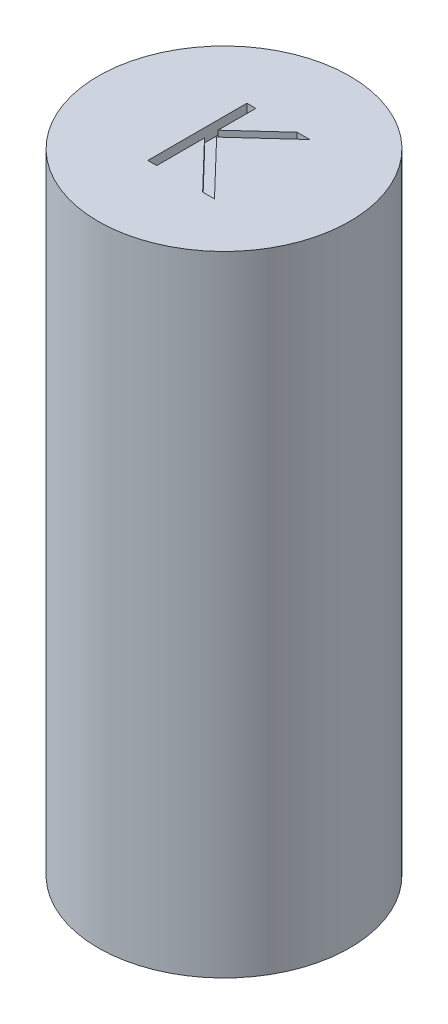
ISO-10303-21;
HEADER;
FILE_DESCRIPTION(('STEP AP214'),'2;1');
FILE_NAME('part.step','',(''),(''),'','','');
FILE_SCHEMA(('AUTOMOTIVE_DESIGN { 1 0 10303 214 1 1 1 1 }'));
ENDSEC;
DATA;
#1=APPLICATION_CONTEXT('core data for automotive mechanical design processes');
#2=APPLICATION_PROTOCOL_DEFINITION('international standard','automotive_design',2000,#1);
#3=PRODUCT_CONTEXT('',#1,'mechanical');
#4=PRODUCT('Part','Part','',(#3));
#5=PRODUCT_RELATED_PRODUCT_CATEGORY('part','',(#4));
#6=PRODUCT_DEFINITION_FORMATION('','',#4);
#7=PRODUCT_DEFINITION_CONTEXT('part definition',#1,'design');
#8=PRODUCT_DEFINITION('design','',#6,#7);
#9=PRODUCT_DEFINITION_SHAPE('','',#8);
#10=(LENGTH_UNIT() NAMED_UNIT(*) SI_UNIT(.MILLI.,.METRE.));
#11=(NAMED_UNIT(*) PLANE_ANGLE_UNIT() SI_UNIT($,.RADIAN.));
#12=(NAMED_UNIT(*) SI_UNIT($,.STERADIAN.) SOLID_ANGLE_UNIT());
#13=UNCERTAINTY_MEASURE_WITH_UNIT(LENGTH_MEASURE(1.E-05),#10,'distance_accuracy_value','');
#14=(GEOMETRIC_REPRESENTATION_CONTEXT(3) GLOBAL_UNCERTAINTY_ASSIGNED_CONTEXT((#13)) GLOBAL_UNIT_ASSIGNED_CONTEXT((#10,
#11,#12)) REPRESENTATION_CONTEXT('',''));
#15=CARTESIAN_POINT('',(0.,0.,0.));
#16=DIRECTION('',(0.,0.,1.));
#17=DIRECTION('',(1.,0.,0.));
#18=AXIS2_PLACEMENT_3D('',#15,#16,#17);
#19=CARTESIAN_POINT('',(0.,95.25,0.));
#20=DIRECTION('',(0.,1.,0.));
#21=DIRECTION('',(0.,0.,1.));
#22=AXIS2_PLACEMENT_3D('',#19,#20,#21);
#23=PLANE('',#22);
#24=CARTESIAN_POINT('',(0.,95.25,0.));
#25=DIRECTION('',(0.,1.,0.));
#26=DIRECTION('',(0.,0.,1.));
#27=AXIS2_PLACEMENT_3D('',#24,#25,#26);
#28=CIRCLE('',#27,19.05);
#29=CARTESIAN_POINT('',(0.,95.25,19.05));
#30=VERTEX_POINT('',#29);
#31=EDGE_CURVE('E11',#30,#30,#28,.T.);
#32=ORIENTED_EDGE('',*,*,#31,.T.);
#33=EDGE_LOOP('',(#32));
#34=FACE_BOUND('',#33,.T.);
#35=DIRECTION('',(-1.,0.,0.));
#36=VECTOR('',#35,1.);
#37=CARTESIAN_POINT('',(-2.88461538461538,95.25,7.30456727166714));
#38=LINE('',#37,#36);
#39=CARTESIAN_POINT('',(-2.88461538461538,95.25,7.30456727166714));
#40=VERTEX_POINT('',#39);
#41=CARTESIAN_POINT('',(-4.23076923076923,95.25,7.30456727166714));
#42=VERTEX_POINT('',#41);
#43=EDGE_CURVE('E195',#40,#42,#38,.T.);
#44=ORIENTED_EDGE('',*,*,#43,.T.);
#45=DIRECTION('',(0.,0.,-1.));
#46=VECTOR('',#45,1.);
#47=CARTESIAN_POINT('',(-4.23076923076923,95.25,7.30456727166714));
#48=LINE('',#47,#46);
#49=CARTESIAN_POINT('',(-4.23076923076923,95.25,-7.69543272833286));
#50=VERTEX_POINT('',#49);
#51=EDGE_CURVE('E55',#42,#50,#48,.T.);
#52=ORIENTED_EDGE('',*,*,#51,.T.);
#53=DIRECTION('',(1.,0.,0.));
#54=VECTOR('',#53,1.);
#55=CARTESIAN_POINT('',(-4.23076923076923,95.25,-7.69543272833286));
#56=LINE('',#55,#54);
#57=CARTESIAN_POINT('',(-2.88461538461538,95.25,-7.69543272833286));
#58=VERTEX_POINT('',#57);
#59=EDGE_CURVE('E162',#50,#58,#56,.T.);
#60=ORIENTED_EDGE('',*,*,#59,.T.);
#61=DIRECTION('',(0.,0.,1.));
#62=VECTOR('',#61,1.);
#63=CARTESIAN_POINT('',(-2.88461538461538,95.25,-7.69543272833286));
#64=LINE('',#63,#62);
#65=CARTESIAN_POINT('',(-2.88461538461538,95.25,-1.98329330525594));
#66=VERTEX_POINT('',#65);
#67=EDGE_CURVE('E166',#58,#66,#64,.T.);
#68=ORIENTED_EDGE('',*,*,#67,.T.);
#69=DIRECTION('',(0.738316488626765,0.,-0.67445441849086));
#70=VECTOR('',#69,1.);
#71=CARTESIAN_POINT('',(-2.88461538461538,95.25,-1.98329330525594));
#72=LINE('',#71,#70);
#73=CARTESIAN_POINT('',(3.36838942307693,95.25,-7.69543272833286));
#74=VERTEX_POINT('',#73);
#75=EDGE_CURVE('E170',#66,#74,#72,.T.);
#76=ORIENTED_EDGE('',*,*,#75,.T.);
#77=DIRECTION('',(1.,0.,0.));
#78=VECTOR('',#77,1.);
#79=CARTESIAN_POINT('',(3.36838942307693,95.25,-7.69543272833286));
#80=LINE('',#79,#78);
#81=CARTESIAN_POINT('',(5.28846153846154,95.25,-7.69543272833286));
#82=VERTEX_POINT('',#81);
#83=EDGE_CURVE('E174',#74,#82,#80,.T.);
#84=ORIENTED_EDGE('',*,*,#83,.T.);
#85=DIRECTION('',(-0.738439871406961,0.,0.674319328149854));
#86=VECTOR('',#85,1.);
#87=CARTESIAN_POINT('',(5.28846153846154,95.25,-7.69543272833286));
#88=LINE('',#87,#86);
#89=CARTESIAN_POINT('',(-2.08233173076923,95.25,-0.964663497563628));
#90=VERTEX_POINT('',#89);
#91=EDGE_CURVE('E178',#82,#90,#88,.T.);
#92=ORIENTED_EDGE('',*,*,#91,.T.);
#93=DIRECTION('',(0.692951629324606,0.,0.720984077089344));
#94=VECTOR('',#93,1.);
#95=CARTESIAN_POINT('',(-2.08233173076923,95.25,-0.964663497563628));
#96=LINE('',#95,#94);
#97=CARTESIAN_POINT('',(5.86538461538462,95.25,7.30456727166714));
#98=VERTEX_POINT('',#97);
#99=EDGE_CURVE('E182',#90,#98,#96,.T.);
#100=ORIENTED_EDGE('',*,*,#99,.T.);
#101=DIRECTION('',(-1.,0.,0.));
#102=VECTOR('',#101,1.);
#103=CARTESIAN_POINT('',(5.86538461538462,95.25,7.30456727166714));
#104=LINE('',#103,#102);
#105=CARTESIAN_POINT('',(4.07151442307692,95.25,7.30456727166714));
#106=VERTEX_POINT('',#105);
#107=EDGE_CURVE('E186',#98,#106,#104,.T.);
#108=ORIENTED_EDGE('',*,*,#107,.T.);
#109=DIRECTION('',(-0.692899332064652,0.,-0.721034337340712));
#110=VECTOR('',#109,1.);
#111=CARTESIAN_POINT('',(4.07151442307692,95.25,7.30456727166714));
#112=LINE('',#111,#110);
#113=CARTESIAN_POINT('',(-2.88461538461538,95.25,0.0659855408979108));
#114=VERTEX_POINT('',#113);
#115=EDGE_CURVE('E190',#106,#114,#112,.T.);
#116=ORIENTED_EDGE('',*,*,#115,.T.);
#117=DIRECTION('',(0.,0.,1.));
#118=VECTOR('',#117,1.);
#119=CARTESIAN_POINT('',(-2.88461538461538,95.25,0.0659855408979108));
#120=LINE('',#119,#118);
#121=EDGE_CURVE('E148',#114,#40,#120,.T.);
#122=ORIENTED_EDGE('',*,*,#121,.T.);
#123=EDGE_LOOP('',(#44,#52,#60,#68,#76,#84,#92,#100,#108,#116,#122));
#124=FACE_BOUND('',#123,.T.);
#125=ADVANCED_FACE('F39',(#34,#124),#23,.T.);
#126=CARTESIAN_POINT('',(0.,95.25,0.));
#127=DIRECTION('',(0.,-1.,0.));
#128=DIRECTION('',(0.,0.,-1.));
#129=AXIS2_PLACEMENT_3D('',#126,#127,#128);
#130=CYLINDRICAL_SURFACE('',#129,19.05);
#131=ORIENTED_EDGE('',*,*,#31,.F.);
#132=EDGE_LOOP('',(#131));
#133=FACE_BOUND('',#132,.T.);
#134=CARTESIAN_POINT('',(0.,0.,0.));
#135=DIRECTION('',(0.,1.,0.));
#136=DIRECTION('',(0.,0.,1.));
#137=AXIS2_PLACEMENT_3D('',#134,#135,#136);
#138=CIRCLE('',#137,19.05);
#139=CARTESIAN_POINT('',(0.,0.,19.05));
#140=VERTEX_POINT('',#139);
#141=EDGE_CURVE('E43',#140,#140,#138,.T.);
#142=ORIENTED_EDGE('',*,*,#141,.T.);
#143=EDGE_LOOP('',(#142));
#144=FACE_BOUND('',#143,.T.);
#145=ADVANCED_FACE('F41',(#133,#144),#130,.T.);
#146=CARTESIAN_POINT('',(0.,0.,0.));
#147=DIRECTION('',(0.,1.,0.));
#148=DIRECTION('',(0.,0.,1.));
#149=AXIS2_PLACEMENT_3D('',#146,#147,#148);
#150=PLANE('',#149);
#151=ORIENTED_EDGE('',*,*,#141,.F.);
#152=EDGE_LOOP('',(#151));
#153=FACE_BOUND('',#152,.T.);
#154=ADVANCED_FACE('F232',(#153),#150,.F.);
#155=CARTESIAN_POINT('',(-4.23076923076923,93.25,7.30456727166714));
#156=DIRECTION('',(1.,0.,0.));
#157=DIRECTION('',(0.,0.,-1.));
#158=AXIS2_PLACEMENT_3D('',#155,#156,#157);
#159=PLANE('',#158);
#160=ORIENTED_EDGE('',*,*,#51,.F.);
#161=DIRECTION('',(0.,1.,0.));
#162=VECTOR('',#161,1.);
#163=CARTESIAN_POINT('',(-4.23076923076923,93.25,7.30456727166714));
#164=LINE('',#163,#162);
#165=CARTESIAN_POINT('',(-4.23076923076923,93.25,7.30456727166714));
#166=VERTEX_POINT('',#165);
#167=EDGE_CURVE('E156',#166,#42,#164,.T.);
#168=ORIENTED_EDGE('',*,*,#167,.F.);
#169=DIRECTION('',(0.,0.,-1.));
#170=VECTOR('',#169,1.);
#171=CARTESIAN_POINT('',(-4.23076923076923,93.25,7.30456727166714));
#172=LINE('',#171,#170);
#173=CARTESIAN_POINT('',(-4.23076923076923,93.25,-7.69543272833286));
#174=VERTEX_POINT('',#173);
#175=EDGE_CURVE('E199',#166,#174,#172,.T.);
#176=ORIENTED_EDGE('',*,*,#175,.T.);
#177=DIRECTION('',(0.,1.,0.));
#178=VECTOR('',#177,1.);
#179=CARTESIAN_POINT('',(-4.23076923076923,93.25,-7.69543272833286));
#180=LINE('',#179,#178);
#181=EDGE_CURVE('E224',#174,#50,#180,.T.);
#182=ORIENTED_EDGE('',*,*,#181,.T.);
#183=EDGE_LOOP('',(#160,#168,#176,#182));
#184=FACE_BOUND('',#183,.T.);
#185=ADVANCED_FACE('F234',(#184),#159,.T.);
#186=CARTESIAN_POINT('',(-4.23076923076923,93.25,-7.69543272833286));
#187=DIRECTION('',(0.,0.,1.));
#188=DIRECTION('',(1.,0.,0.));
#189=AXIS2_PLACEMENT_3D('',#186,#187,#188);
#190=PLANE('',#189);
#191=ORIENTED_EDGE('',*,*,#59,.F.);
#192=ORIENTED_EDGE('',*,*,#181,.F.);
#193=DIRECTION('',(1.,0.,0.));
#194=VECTOR('',#193,1.);
#195=CARTESIAN_POINT('',(-4.23076923076923,93.25,-7.69543272833286));
#196=LINE('',#195,#194);
#197=CARTESIAN_POINT('',(-2.88461538461538,93.25,-7.69543272833286));
#198=VERTEX_POINT('',#197);
#199=EDGE_CURVE('E109',#174,#198,#196,.T.);
#200=ORIENTED_EDGE('',*,*,#199,.T.);
#201=DIRECTION('',(0.,1.,0.));
#202=VECTOR('',#201,1.);
#203=CARTESIAN_POINT('',(-2.88461538461538,93.25,-7.69543272833286));
#204=LINE('',#203,#202);
#205=EDGE_CURVE('E221',#198,#58,#204,.T.);
#206=ORIENTED_EDGE('',*,*,#205,.T.);
#207=EDGE_LOOP('',(#191,#192,#200,#206));
#208=FACE_BOUND('',#207,.T.);
#209=ADVANCED_FACE('F239',(#208),#190,.T.);
#210=CARTESIAN_POINT('',(-2.88461538461538,93.25,-7.69543272833286));
#211=DIRECTION('',(-1.,0.,0.));
#212=DIRECTION('',(0.,0.,1.));
#213=AXIS2_PLACEMENT_3D('',#210,#211,#212);
#214=PLANE('',#213);
#215=ORIENTED_EDGE('',*,*,#67,.F.);
#216=ORIENTED_EDGE('',*,*,#205,.F.);
#217=DIRECTION('',(0.,0.,1.));
#218=VECTOR('',#217,1.);
#219=CARTESIAN_POINT('',(-2.88461538461538,93.25,-7.69543272833286));
#220=LINE('',#219,#218);
#221=CARTESIAN_POINT('',(-2.88461538461538,93.25,-1.98329330525594));
#222=VERTEX_POINT('',#221);
#223=EDGE_CURVE('E388',#198,#222,#220,.T.);
#224=ORIENTED_EDGE('',*,*,#223,.T.);
#225=DIRECTION('',(0.,1.,0.));
#226=VECTOR('',#225,1.);
#227=CARTESIAN_POINT('',(-2.88461538461538,93.25,-1.98329330525594));
#228=LINE('',#227,#226);
#229=EDGE_CURVE('E218',#222,#66,#228,.T.);
#230=ORIENTED_EDGE('',*,*,#229,.T.);
#231=EDGE_LOOP('',(#215,#216,#224,#230));
#232=FACE_BOUND('',#231,.T.);
#233=ADVANCED_FACE('F251',(#232),#214,.T.);
#234=CARTESIAN_POINT('',(-2.88461538461538,93.25,-1.98329330525594));
#235=DIRECTION('',(0.67445441849086,0.,0.738316488626765));
#236=DIRECTION('',(0.738316488626765,0.,-0.67445441849086));
#237=AXIS2_PLACEMENT_3D('',#234,#235,#236);
#238=PLANE('',#237);
#239=ORIENTED_EDGE('',*,*,#75,.F.);
#240=ORIENTED_EDGE('',*,*,#229,.F.);
#241=DIRECTION('',(0.738316488626765,0.,-0.67445441849086));
#242=VECTOR('',#241,1.);
#243=CARTESIAN_POINT('',(-2.88461538461538,93.25,-1.98329330525594));
#244=LINE('',#243,#242);
#245=CARTESIAN_POINT('',(3.36838942307693,93.25,-7.69543272833286));
#246=VERTEX_POINT('',#245);
#247=EDGE_CURVE('E385',#222,#246,#244,.T.);
#248=ORIENTED_EDGE('',*,*,#247,.T.);
#249=DIRECTION('',(0.,1.,0.));
#250=VECTOR('',#249,1.);
#251=CARTESIAN_POINT('',(3.36838942307693,93.25,-7.69543272833286));
#252=LINE('',#251,#250);
#253=EDGE_CURVE('E215',#246,#74,#252,.T.);
#254=ORIENTED_EDGE('',*,*,#253,.T.);
#255=EDGE_LOOP('',(#239,#240,#248,#254));
#256=FACE_BOUND('',#255,.T.);
#257=ADVANCED_FACE('F255',(#256),#238,.T.);
#258=CARTESIAN_POINT('',(3.36838942307693,93.25,-7.69543272833286));
#259=DIRECTION('',(0.,0.,1.));
#260=DIRECTION('',(1.,0.,0.));
#261=AXIS2_PLACEMENT_3D('',#258,#259,#260);
#262=PLANE('',#261);
#263=ORIENTED_EDGE('',*,*,#83,.F.);
#264=ORIENTED_EDGE('',*,*,#253,.F.);
#265=DIRECTION('',(1.,0.,0.));
#266=VECTOR('',#265,1.);
#267=CARTESIAN_POINT('',(3.36838942307693,93.25,-7.69543272833286));
#268=LINE('',#267,#266);
#269=CARTESIAN_POINT('',(5.28846153846154,93.25,-7.69543272833286));
#270=VERTEX_POINT('',#269);
#271=EDGE_CURVE('E382',#246,#270,#268,.T.);
#272=ORIENTED_EDGE('',*,*,#271,.T.);
#273=DIRECTION('',(0.,1.,0.));
#274=VECTOR('',#273,1.);
#275=CARTESIAN_POINT('',(5.28846153846154,93.25,-7.69543272833286));
#276=LINE('',#275,#274);
#277=EDGE_CURVE('E212',#270,#82,#276,.T.);
#278=ORIENTED_EDGE('',*,*,#277,.T.);
#279=EDGE_LOOP('',(#263,#264,#272,#278));
#280=FACE_BOUND('',#279,.T.);
#281=ADVANCED_FACE('F259',(#280),#262,.T.);
#282=CARTESIAN_POINT('',(5.28846153846154,93.25,-7.69543272833286));
#283=DIRECTION('',(-0.674319328149854,0.,-0.738439871406961));
#284=DIRECTION('',(-0.738439871406961,0.,0.674319328149854));
#285=AXIS2_PLACEMENT_3D('',#282,#283,#284);
#286=PLANE('',#285);
#287=ORIENTED_EDGE('',*,*,#91,.F.);
#288=ORIENTED_EDGE('',*,*,#277,.F.);
#289=DIRECTION('',(-0.738439871406961,0.,0.674319328149854));
#290=VECTOR('',#289,1.);
#291=CARTESIAN_POINT('',(5.28846153846154,93.25,-7.69543272833286));
#292=LINE('',#291,#290);
#293=CARTESIAN_POINT('',(-2.08233173076923,93.25,-0.964663497563628));
#294=VERTEX_POINT('',#293);
#295=EDGE_CURVE('E377',#270,#294,#292,.T.);
#296=ORIENTED_EDGE('',*,*,#295,.T.);
#297=DIRECTION('',(0.,1.,0.));
#298=VECTOR('',#297,1.);
#299=CARTESIAN_POINT('',(-2.08233173076923,93.25,-0.964663497563628));
#300=LINE('',#299,#298);
#301=EDGE_CURVE('E209',#294,#90,#300,.T.);
#302=ORIENTED_EDGE('',*,*,#301,.T.);
#303=EDGE_LOOP('',(#287,#288,#296,#302));
#304=FACE_BOUND('',#303,.T.);
#305=ADVANCED_FACE('F263',(#304),#286,.T.);
#306=CARTESIAN_POINT('',(-2.08233173076923,93.25,-0.964663497563628));
#307=DIRECTION('',(-0.720984077089345,0.,0.692951629324606));
#308=DIRECTION('',(0.692951629324606,0.,0.720984077089344));
#309=AXIS2_PLACEMENT_3D('',#306,#307,#308);
#310=PLANE('',#309);
#311=ORIENTED_EDGE('',*,*,#99,.F.);
#312=ORIENTED_EDGE('',*,*,#301,.F.);
#313=DIRECTION('',(0.692951629324606,0.,0.720984077089344));
#314=VECTOR('',#313,1.);
#315=CARTESIAN_POINT('',(-2.08233173076923,93.25,-0.964663497563628));
#316=LINE('',#315,#314);
#317=CARTESIAN_POINT('',(5.86538461538462,93.25,7.30456727166714));
#318=VERTEX_POINT('',#317);
#319=EDGE_CURVE('E375',#294,#318,#316,.T.);
#320=ORIENTED_EDGE('',*,*,#319,.T.);
#321=DIRECTION('',(0.,1.,0.));
#322=VECTOR('',#321,1.);
#323=CARTESIAN_POINT('',(5.86538461538462,93.25,7.30456727166714));
#324=LINE('',#323,#322);
#325=EDGE_CURVE('E206',#318,#98,#324,.T.);
#326=ORIENTED_EDGE('',*,*,#325,.T.);
#327=EDGE_LOOP('',(#311,#312,#320,#326));
#328=FACE_BOUND('',#327,.T.);
#329=ADVANCED_FACE('F267',(#328),#310,.T.);
#330=CARTESIAN_POINT('',(5.86538461538462,93.25,7.30456727166714));
#331=DIRECTION('',(0.,0.,-1.));
#332=DIRECTION('',(-1.,0.,0.));
#333=AXIS2_PLACEMENT_3D('',#330,#331,#332);
#334=PLANE('',#333);
#335=ORIENTED_EDGE('',*,*,#107,.F.);
#336=ORIENTED_EDGE('',*,*,#325,.F.);
#337=DIRECTION('',(-1.,0.,0.));
#338=VECTOR('',#337,1.);
#339=CARTESIAN_POINT('',(5.86538461538462,93.25,7.30456727166714));
#340=LINE('',#339,#338);
#341=CARTESIAN_POINT('',(4.07151442307692,93.25,7.30456727166714));
#342=VERTEX_POINT('',#341);
#343=EDGE_CURVE('E144',#318,#342,#340,.T.);
#344=ORIENTED_EDGE('',*,*,#343,.T.);
#345=DIRECTION('',(0.,1.,0.));
#346=VECTOR('',#345,1.);
#347=CARTESIAN_POINT('',(4.07151442307692,93.25,7.30456727166714));
#348=LINE('',#347,#346);
#349=EDGE_CURVE('E139',#342,#106,#348,.T.);
#350=ORIENTED_EDGE('',*,*,#349,.T.);
#351=EDGE_LOOP('',(#335,#336,#344,#350));
#352=FACE_BOUND('',#351,.T.);
#353=ADVANCED_FACE('F271',(#352),#334,.T.);
#354=CARTESIAN_POINT('',(4.07151442307692,93.25,7.30456727166714));
#355=DIRECTION('',(0.721034337340712,0.,-0.692899332064652));
#356=DIRECTION('',(-0.692899332064652,0.,-0.721034337340712));
#357=AXIS2_PLACEMENT_3D('',#354,#355,#356);
#358=PLANE('',#357);
#359=ORIENTED_EDGE('',*,*,#115,.F.);
#360=ORIENTED_EDGE('',*,*,#349,.F.);
#361=DIRECTION('',(-0.692899332064652,0.,-0.721034337340712));
#362=VECTOR('',#361,1.);
#363=CARTESIAN_POINT('',(4.07151442307692,93.25,7.30456727166714));
#364=LINE('',#363,#362);
#365=CARTESIAN_POINT('',(-2.88461538461538,93.25,0.0659855408979108));
#366=VERTEX_POINT('',#365);
#367=EDGE_CURVE('E134',#342,#366,#364,.T.);
#368=ORIENTED_EDGE('',*,*,#367,.T.);
#369=DIRECTION('',(0.,1.,0.));
#370=VECTOR('',#369,1.);
#371=CARTESIAN_POINT('',(-2.88461538461538,93.25,0.0659855408979108));
#372=LINE('',#371,#370);
#373=EDGE_CURVE('E138',#366,#114,#372,.T.);
#374=ORIENTED_EDGE('',*,*,#373,.T.);
#375=EDGE_LOOP('',(#359,#360,#368,#374));
#376=FACE_BOUND('',#375,.T.);
#377=ADVANCED_FACE('F137',(#376),#358,.T.);
#378=CARTESIAN_POINT('',(-2.88461538461538,93.25,0.0659855408979108));
#379=DIRECTION('',(-1.,0.,0.));
#380=DIRECTION('',(0.,0.,1.));
#381=AXIS2_PLACEMENT_3D('',#378,#379,#380);
#382=PLANE('',#381);
#383=ORIENTED_EDGE('',*,*,#121,.F.);
#384=ORIENTED_EDGE('',*,*,#373,.F.);
#385=DIRECTION('',(0.,0.,1.));
#386=VECTOR('',#385,1.);
#387=CARTESIAN_POINT('',(-2.88461538461538,93.25,0.0659855408979108));
#388=LINE('',#387,#386);
#389=CARTESIAN_POINT('',(-2.88461538461538,93.25,7.30456727166714));
#390=VERTEX_POINT('',#389);
#391=EDGE_CURVE('E143',#366,#390,#388,.T.);
#392=ORIENTED_EDGE('',*,*,#391,.T.);
#393=DIRECTION('',(0.,1.,0.));
#394=VECTOR('',#393,1.);
#395=CARTESIAN_POINT('',(-2.88461538461538,93.25,7.30456727166714));
#396=LINE('',#395,#394);
#397=EDGE_CURVE('E100',#390,#40,#396,.T.);
#398=ORIENTED_EDGE('',*,*,#397,.T.);
#399=EDGE_LOOP('',(#383,#384,#392,#398));
#400=FACE_BOUND('',#399,.T.);
#401=ADVANCED_FACE('F146',(#400),#382,.T.);
#402=CARTESIAN_POINT('',(-2.88461538461538,93.25,7.30456727166714));
#403=DIRECTION('',(0.,0.,-1.));
#404=DIRECTION('',(-1.,0.,0.));
#405=AXIS2_PLACEMENT_3D('',#402,#403,#404);
#406=PLANE('',#405);
#407=ORIENTED_EDGE('',*,*,#43,.F.);
#408=ORIENTED_EDGE('',*,*,#397,.F.);
#409=DIRECTION('',(-1.,0.,0.));
#410=VECTOR('',#409,1.);
#411=CARTESIAN_POINT('',(-2.88461538461538,93.25,7.30456727166714));
#412=LINE('',#411,#410);
#413=EDGE_CURVE('E63',#390,#166,#412,.T.);
#414=ORIENTED_EDGE('',*,*,#413,.T.);
#415=ORIENTED_EDGE('',*,*,#167,.T.);
#416=EDGE_LOOP('',(#407,#408,#414,#415));
#417=FACE_BOUND('',#416,.T.);
#418=ADVANCED_FACE('F280',(#417),#406,.T.);
#419=CARTESIAN_POINT('',(0.,93.25,0.));
#420=DIRECTION('',(0.,-1.,0.));
#421=DIRECTION('',(0.,0.,-1.));
#422=AXIS2_PLACEMENT_3D('',#419,#420,#421);
#423=PLANE('',#422);
#424=ORIENTED_EDGE('',*,*,#175,.F.);
#425=ORIENTED_EDGE('',*,*,#413,.F.);
#426=ORIENTED_EDGE('',*,*,#391,.F.);
#427=ORIENTED_EDGE('',*,*,#367,.F.);
#428=ORIENTED_EDGE('',*,*,#343,.F.);
#429=ORIENTED_EDGE('',*,*,#319,.F.);
#430=ORIENTED_EDGE('',*,*,#295,.F.);
#431=ORIENTED_EDGE('',*,*,#271,.F.);
#432=ORIENTED_EDGE('',*,*,#247,.F.);
#433=ORIENTED_EDGE('',*,*,#223,.F.);
#434=ORIENTED_EDGE('',*,*,#199,.F.);
#435=EDGE_LOOP('',(#424,#425,#426,#427,#428,#429,#430,#431,#432,#433,#434));
#436=FACE_BOUND('',#435,.T.);
#437=ADVANCED_FACE('F152',(#436),#423,.F.);
#438=CLOSED_SHELL('',(#125,#145,#154,#185,#209,#233,#257,#281,#305,#329,#353,#377,#401,#418,#437));
#439=MANIFOLD_SOLID_BREP('B2',#438);
#440=ADVANCED_BREP_SHAPE_REPRESENTATION('',(#18,#439),#14);
#441=SHAPE_DEFINITION_REPRESENTATION(#9,#440);
ENDSEC;
END-ISO-10303-21;
